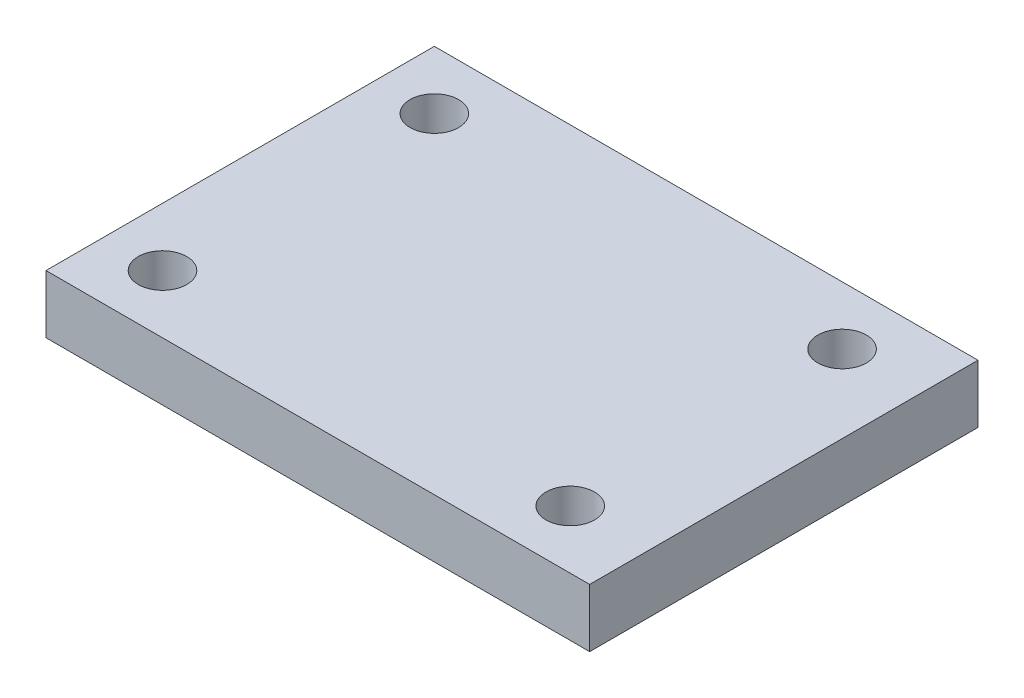
ISO-10303-21;
HEADER;
FILE_DESCRIPTION(('STEP AP214'),'2;1');
FILE_NAME('part.step','',(''),(''),'','','');
FILE_SCHEMA(('AUTOMOTIVE_DESIGN { 1 0 10303 214 1 1 1 1 }'));
ENDSEC;
DATA;
#1=APPLICATION_CONTEXT('core data for automotive mechanical design processes');
#2=APPLICATION_PROTOCOL_DEFINITION('international standard','automotive_design',2000,#1);
#3=PRODUCT_CONTEXT('',#1,'mechanical');
#4=PRODUCT('Part','Part','',(#3));
#5=PRODUCT_RELATED_PRODUCT_CATEGORY('part','',(#4));
#6=PRODUCT_DEFINITION_FORMATION('','',#4);
#7=PRODUCT_DEFINITION_CONTEXT('part definition',#1,'design');
#8=PRODUCT_DEFINITION('design','',#6,#7);
#9=PRODUCT_DEFINITION_SHAPE('','',#8);
#10=(LENGTH_UNIT() NAMED_UNIT(*) SI_UNIT(.MILLI.,.METRE.));
#11=(NAMED_UNIT(*) PLANE_ANGLE_UNIT() SI_UNIT($,.RADIAN.));
#12=(NAMED_UNIT(*) SI_UNIT($,.STERADIAN.) SOLID_ANGLE_UNIT());
#13=UNCERTAINTY_MEASURE_WITH_UNIT(LENGTH_MEASURE(1.E-05),#10,'distance_accuracy_value','');
#14=(GEOMETRIC_REPRESENTATION_CONTEXT(3) GLOBAL_UNCERTAINTY_ASSIGNED_CONTEXT((#13)) GLOBAL_UNIT_ASSIGNED_CONTEXT((#10,
#11,#12)) REPRESENTATION_CONTEXT('',''));
#15=CARTESIAN_POINT('',(0.,0.,0.));
#16=DIRECTION('',(0.,0.,1.));
#17=DIRECTION('',(1.,0.,0.));
#18=AXIS2_PLACEMENT_3D('',#15,#16,#17);
#19=CARTESIAN_POINT('',(14.,3.,-10.));
#20=DIRECTION('',(-1.,0.,0.));
#21=DIRECTION('',(0.,0.,1.));
#22=AXIS2_PLACEMENT_3D('',#19,#20,#21);
#23=PLANE('',#22);
#24=DIRECTION('',(0.,0.,-1.));
#25=VECTOR('',#24,1.);
#26=CARTESIAN_POINT('',(14.,0.,-10.));
#27=LINE('',#26,#25);
#28=CARTESIAN_POINT('',(14.,0.,10.));
#29=VERTEX_POINT('',#28);
#30=CARTESIAN_POINT('',(14.,0.,-10.));
#31=VERTEX_POINT('',#30);
#32=EDGE_CURVE('E100',#29,#31,#27,.T.);
#33=ORIENTED_EDGE('',*,*,#32,.T.);
#34=DIRECTION('',(0.,-1.,0.));
#35=VECTOR('',#34,1.);
#36=CARTESIAN_POINT('',(14.,3.,-10.));
#37=LINE('',#36,#35);
#38=CARTESIAN_POINT('',(14.,3.,-10.));
#39=VERTEX_POINT('',#38);
#40=EDGE_CURVE('E11',#39,#31,#37,.T.);
#41=ORIENTED_EDGE('',*,*,#40,.F.);
#42=DIRECTION('',(0.,0.,-1.));
#43=VECTOR('',#42,1.);
#44=CARTESIAN_POINT('',(14.,3.,-10.));
#45=LINE('',#44,#43);
#46=CARTESIAN_POINT('',(14.,3.,10.));
#47=VERTEX_POINT('',#46);
#48=EDGE_CURVE('E88',#47,#39,#45,.T.);
#49=ORIENTED_EDGE('',*,*,#48,.F.);
#50=DIRECTION('',(0.,-1.,0.));
#51=VECTOR('',#50,1.);
#52=CARTESIAN_POINT('',(14.,3.,10.));
#53=LINE('',#52,#51);
#54=EDGE_CURVE('E96',#47,#29,#53,.T.);
#55=ORIENTED_EDGE('',*,*,#54,.T.);
#56=EDGE_LOOP('',(#33,#41,#49,#55));
#57=FACE_BOUND('',#56,.T.);
#58=ADVANCED_FACE('F37',(#57),#23,.F.);
#59=CARTESIAN_POINT('',(-14.,3.,-10.));
#60=DIRECTION('',(0.,0.,1.));
#61=DIRECTION('',(1.,0.,0.));
#62=AXIS2_PLACEMENT_3D('',#59,#60,#61);
#63=PLANE('',#62);
#64=DIRECTION('',(-1.,0.,0.));
#65=VECTOR('',#64,1.);
#66=CARTESIAN_POINT('',(-14.,0.,-10.));
#67=LINE('',#66,#65);
#68=CARTESIAN_POINT('',(-14.,0.,-10.));
#69=VERTEX_POINT('',#68);
#70=EDGE_CURVE('E92',#31,#69,#67,.T.);
#71=ORIENTED_EDGE('',*,*,#70,.T.);
#72=DIRECTION('',(0.,-1.,0.));
#73=VECTOR('',#72,1.);
#74=CARTESIAN_POINT('',(-14.,3.,-10.));
#75=LINE('',#74,#73);
#76=CARTESIAN_POINT('',(-14.,3.,-10.));
#77=VERTEX_POINT('',#76);
#78=EDGE_CURVE('E45',#77,#69,#75,.T.);
#79=ORIENTED_EDGE('',*,*,#78,.F.);
#80=DIRECTION('',(-1.,0.,0.));
#81=VECTOR('',#80,1.);
#82=CARTESIAN_POINT('',(-14.,3.,-10.));
#83=LINE('',#82,#81);
#84=EDGE_CURVE('E83',#39,#77,#83,.T.);
#85=ORIENTED_EDGE('',*,*,#84,.F.);
#86=ORIENTED_EDGE('',*,*,#40,.T.);
#87=EDGE_LOOP('',(#71,#79,#85,#86));
#88=FACE_BOUND('',#87,.T.);
#89=ADVANCED_FACE('F91',(#88),#63,.F.);
#90=CARTESIAN_POINT('',(-14.,3.,-10.));
#91=DIRECTION('',(1.,0.,0.));
#92=DIRECTION('',(0.,0.,-1.));
#93=AXIS2_PLACEMENT_3D('',#90,#91,#92);
#94=PLANE('',#93);
#95=DIRECTION('',(0.,0.,1.));
#96=VECTOR('',#95,1.);
#97=CARTESIAN_POINT('',(-14.,0.,-10.));
#98=LINE('',#97,#96);
#99=CARTESIAN_POINT('',(-14.,0.,10.));
#100=VERTEX_POINT('',#99);
#101=EDGE_CURVE('E70',#69,#100,#98,.T.);
#102=ORIENTED_EDGE('',*,*,#101,.T.);
#103=DIRECTION('',(0.,-1.,0.));
#104=VECTOR('',#103,1.);
#105=CARTESIAN_POINT('',(-14.,3.,10.));
#106=LINE('',#105,#104);
#107=CARTESIAN_POINT('',(-14.,3.,10.));
#108=VERTEX_POINT('',#107);
#109=EDGE_CURVE('E93',#108,#100,#106,.T.);
#110=ORIENTED_EDGE('',*,*,#109,.F.);
#111=DIRECTION('',(0.,0.,1.));
#112=VECTOR('',#111,1.);
#113=CARTESIAN_POINT('',(-14.,3.,-10.));
#114=LINE('',#113,#112);
#115=EDGE_CURVE('E86',#77,#108,#114,.T.);
#116=ORIENTED_EDGE('',*,*,#115,.F.);
#117=ORIENTED_EDGE('',*,*,#78,.T.);
#118=EDGE_LOOP('',(#102,#110,#116,#117));
#119=FACE_BOUND('',#118,.T.);
#120=ADVANCED_FACE('F94',(#119),#94,.F.);
#121=CARTESIAN_POINT('',(-14.,3.,10.));
#122=DIRECTION('',(0.,0.,-1.));
#123=DIRECTION('',(-1.,0.,0.));
#124=AXIS2_PLACEMENT_3D('',#121,#122,#123);
#125=PLANE('',#124);
#126=DIRECTION('',(1.,0.,0.));
#127=VECTOR('',#126,1.);
#128=CARTESIAN_POINT('',(-14.,0.,10.));
#129=LINE('',#128,#127);
#130=EDGE_CURVE('E76',#100,#29,#129,.T.);
#131=ORIENTED_EDGE('',*,*,#130,.T.);
#132=ORIENTED_EDGE('',*,*,#54,.F.);
#133=DIRECTION('',(1.,0.,0.));
#134=VECTOR('',#133,1.);
#135=CARTESIAN_POINT('',(-14.,3.,10.));
#136=LINE('',#135,#134);
#137=EDGE_CURVE('E53',#108,#47,#136,.T.);
#138=ORIENTED_EDGE('',*,*,#137,.F.);
#139=ORIENTED_EDGE('',*,*,#109,.T.);
#140=EDGE_LOOP('',(#131,#132,#138,#139));
#141=FACE_BOUND('',#140,.T.);
#142=ADVANCED_FACE('F108',(#141),#125,.F.);
#143=CARTESIAN_POINT('',(0.,3.,0.));
#144=DIRECTION('',(0.,1.,0.));
#145=DIRECTION('',(0.,0.,1.));
#146=AXIS2_PLACEMENT_3D('',#143,#144,#145);
#147=PLANE('',#146);
#148=CARTESIAN_POINT('',(-11.,3.,-7.));
#149=DIRECTION('',(0.,1.,0.));
#150=DIRECTION('',(0.,0.,1.));
#151=AXIS2_PLACEMENT_3D('',#148,#149,#150);
#152=CIRCLE('',#151,1.24999999999999);
#153=CARTESIAN_POINT('',(-11.,3.,-5.75000000000001));
#154=VERTEX_POINT('',#153);
#155=EDGE_CURVE('E134',#154,#154,#152,.T.);
#156=ORIENTED_EDGE('',*,*,#155,.F.);
#157=EDGE_LOOP('',(#156));
#158=FACE_BOUND('',#157,.T.);
#159=CARTESIAN_POINT('',(-11.,3.,7.));
#160=DIRECTION('',(0.,1.,0.));
#161=DIRECTION('',(0.,0.,1.));
#162=AXIS2_PLACEMENT_3D('',#159,#160,#161);
#163=CIRCLE('',#162,1.24999999999999);
#164=CARTESIAN_POINT('',(-11.,3.,8.24999999999999));
#165=VERTEX_POINT('',#164);
#166=EDGE_CURVE('E128',#165,#165,#163,.T.);
#167=ORIENTED_EDGE('',*,*,#166,.F.);
#168=EDGE_LOOP('',(#167));
#169=FACE_BOUND('',#168,.T.);
#170=CARTESIAN_POINT('',(9.99999999999997,3.,7.));
#171=DIRECTION('',(0.,1.,0.));
#172=DIRECTION('',(0.,0.,1.));
#173=AXIS2_PLACEMENT_3D('',#170,#171,#172);
#174=CIRCLE('',#173,1.24999999999999);
#175=CARTESIAN_POINT('',(9.99999999999997,3.,8.24999999999999));
#176=VERTEX_POINT('',#175);
#177=EDGE_CURVE('E122',#176,#176,#174,.T.);
#178=ORIENTED_EDGE('',*,*,#177,.F.);
#179=EDGE_LOOP('',(#178));
#180=FACE_BOUND('',#179,.T.);
#181=CARTESIAN_POINT('',(9.99999999999997,3.,-7.));
#182=DIRECTION('',(0.,1.,0.));
#183=DIRECTION('',(0.,0.,1.));
#184=AXIS2_PLACEMENT_3D('',#181,#182,#183);
#185=CIRCLE('',#184,1.24999999999999);
#186=CARTESIAN_POINT('',(9.99999999999997,3.,-5.75000000000001));
#187=VERTEX_POINT('',#186);
#188=EDGE_CURVE('E116',#187,#187,#185,.T.);
#189=ORIENTED_EDGE('',*,*,#188,.F.);
#190=EDGE_LOOP('',(#189));
#191=FACE_BOUND('',#190,.T.);
#192=ORIENTED_EDGE('',*,*,#48,.T.);
#193=ORIENTED_EDGE('',*,*,#84,.T.);
#194=ORIENTED_EDGE('',*,*,#115,.T.);
#195=ORIENTED_EDGE('',*,*,#137,.T.);
#196=EDGE_LOOP('',(#192,#193,#194,#195));
#197=FACE_BOUND('',#196,.T.);
#198=ADVANCED_FACE('F84',(#158,#169,#180,#191,#197),#147,.T.);
#199=CARTESIAN_POINT('',(0.,0.,0.));
#200=DIRECTION('',(0.,1.,0.));
#201=DIRECTION('',(0.,0.,1.));
#202=AXIS2_PLACEMENT_3D('',#199,#200,#201);
#203=PLANE('',#202);
#204=CARTESIAN_POINT('',(-11.,0.,-7.));
#205=DIRECTION('',(0.,1.,0.));
#206=DIRECTION('',(0.,0.,1.));
#207=AXIS2_PLACEMENT_3D('',#204,#205,#206);
#208=CIRCLE('',#207,1.25);
#209=CARTESIAN_POINT('',(-11.,0.,-5.75));
#210=VERTEX_POINT('',#209);
#211=EDGE_CURVE('E131',#210,#210,#208,.T.);
#212=ORIENTED_EDGE('',*,*,#211,.T.);
#213=EDGE_LOOP('',(#212));
#214=FACE_BOUND('',#213,.T.);
#215=CARTESIAN_POINT('',(-11.,0.,7.));
#216=DIRECTION('',(0.,1.,0.));
#217=DIRECTION('',(0.,0.,1.));
#218=AXIS2_PLACEMENT_3D('',#215,#216,#217);
#219=CIRCLE('',#218,1.25);
#220=CARTESIAN_POINT('',(-11.,0.,8.25));
#221=VERTEX_POINT('',#220);
#222=EDGE_CURVE('E125',#221,#221,#219,.T.);
#223=ORIENTED_EDGE('',*,*,#222,.T.);
#224=EDGE_LOOP('',(#223));
#225=FACE_BOUND('',#224,.T.);
#226=CARTESIAN_POINT('',(9.99999999999997,0.,7.));
#227=DIRECTION('',(0.,1.,0.));
#228=DIRECTION('',(0.,0.,1.));
#229=AXIS2_PLACEMENT_3D('',#226,#227,#228);
#230=CIRCLE('',#229,1.25);
#231=CARTESIAN_POINT('',(9.99999999999997,0.,8.25));
#232=VERTEX_POINT('',#231);
#233=EDGE_CURVE('E119',#232,#232,#230,.T.);
#234=ORIENTED_EDGE('',*,*,#233,.T.);
#235=EDGE_LOOP('',(#234));
#236=FACE_BOUND('',#235,.T.);
#237=CARTESIAN_POINT('',(9.99999999999997,0.,-7.));
#238=DIRECTION('',(0.,1.,0.));
#239=DIRECTION('',(0.,0.,1.));
#240=AXIS2_PLACEMENT_3D('',#237,#238,#239);
#241=CIRCLE('',#240,1.25);
#242=CARTESIAN_POINT('',(9.99999999999997,0.,-5.75));
#243=VERTEX_POINT('',#242);
#244=EDGE_CURVE('E103',#243,#243,#241,.T.);
#245=ORIENTED_EDGE('',*,*,#244,.T.);
#246=EDGE_LOOP('',(#245));
#247=FACE_BOUND('',#246,.T.);
#248=ORIENTED_EDGE('',*,*,#32,.F.);
#249=ORIENTED_EDGE('',*,*,#130,.F.);
#250=ORIENTED_EDGE('',*,*,#101,.F.);
#251=ORIENTED_EDGE('',*,*,#70,.F.);
#252=EDGE_LOOP('',(#248,#249,#250,#251));
#253=FACE_BOUND('',#252,.T.);
#254=ADVANCED_FACE('F111',(#214,#225,#236,#247,#253),#203,.F.);
#255=CARTESIAN_POINT('',(9.99999999999997,3.,-7.));
#256=DIRECTION('',(0.,1.,0.));
#257=DIRECTION('',(0.,0.,1.));
#258=AXIS2_PLACEMENT_3D('',#255,#256,#257);
#259=CYLINDRICAL_SURFACE('',#258,1.24999999999999);
#260=ORIENTED_EDGE('',*,*,#244,.F.);
#261=EDGE_LOOP('',(#260));
#262=FACE_BOUND('',#261,.T.);
#263=ORIENTED_EDGE('',*,*,#188,.T.);
#264=EDGE_LOOP('',(#263));
#265=FACE_BOUND('',#264,.T.);
#266=ADVANCED_FACE('F149',(#262,#265),#259,.F.);
#267=CARTESIAN_POINT('',(9.99999999999997,3.,7.));
#268=DIRECTION('',(0.,1.,0.));
#269=DIRECTION('',(0.,0.,1.));
#270=AXIS2_PLACEMENT_3D('',#267,#268,#269);
#271=CYLINDRICAL_SURFACE('',#270,1.24999999999999);
#272=ORIENTED_EDGE('',*,*,#233,.F.);
#273=EDGE_LOOP('',(#272));
#274=FACE_BOUND('',#273,.T.);
#275=ORIENTED_EDGE('',*,*,#177,.T.);
#276=EDGE_LOOP('',(#275));
#277=FACE_BOUND('',#276,.T.);
#278=ADVANCED_FACE('F151',(#274,#277),#271,.F.);
#279=CARTESIAN_POINT('',(-11.,3.,7.));
#280=DIRECTION('',(0.,1.,0.));
#281=DIRECTION('',(0.,0.,1.));
#282=AXIS2_PLACEMENT_3D('',#279,#280,#281);
#283=CYLINDRICAL_SURFACE('',#282,1.24999999999999);
#284=ORIENTED_EDGE('',*,*,#222,.F.);
#285=EDGE_LOOP('',(#284));
#286=FACE_BOUND('',#285,.T.);
#287=ORIENTED_EDGE('',*,*,#166,.T.);
#288=EDGE_LOOP('',(#287));
#289=FACE_BOUND('',#288,.T.);
#290=ADVANCED_FACE('F158',(#286,#289),#283,.F.);
#291=CARTESIAN_POINT('',(-11.,3.,-7.));
#292=DIRECTION('',(0.,1.,0.));
#293=DIRECTION('',(0.,0.,1.));
#294=AXIS2_PLACEMENT_3D('',#291,#292,#293);
#295=CYLINDRICAL_SURFACE('',#294,1.24999999999999);
#296=ORIENTED_EDGE('',*,*,#211,.F.);
#297=EDGE_LOOP('',(#296));
#298=FACE_BOUND('',#297,.T.);
#299=ORIENTED_EDGE('',*,*,#155,.T.);
#300=EDGE_LOOP('',(#299));
#301=FACE_BOUND('',#300,.T.);
#302=ADVANCED_FACE('F138',(#298,#301),#295,.F.);
#303=CLOSED_SHELL('',(#58,#89,#120,#142,#198,#254,#266,#278,#290,#302));
#304=MANIFOLD_SOLID_BREP('B2',#303);
#305=ADVANCED_BREP_SHAPE_REPRESENTATION('',(#18,#304),#14);
#306=SHAPE_DEFINITION_REPRESENTATION(#9,#305);
ENDSEC;
END-ISO-10303-21;
